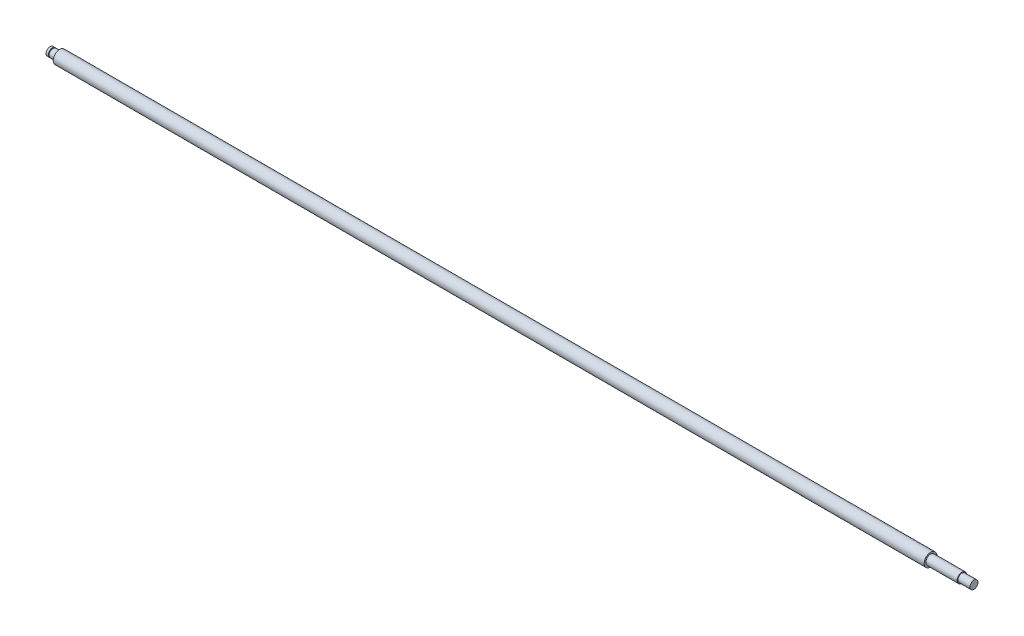
ISO-10303-21;
HEADER;
FILE_DESCRIPTION(('STEP AP214'),'2;1');
FILE_NAME('part.step','',(''),(''),'','','');
FILE_SCHEMA(('AUTOMOTIVE_DESIGN { 1 0 10303 214 1 1 1 1 }'));
ENDSEC;
DATA;
#1=APPLICATION_CONTEXT('core data for automotive mechanical design processes');
#2=APPLICATION_PROTOCOL_DEFINITION('international standard','automotive_design',2000,#1);
#3=PRODUCT_CONTEXT('',#1,'mechanical');
#4=PRODUCT('Part','Part','',(#3));
#5=PRODUCT_RELATED_PRODUCT_CATEGORY('part','',(#4));
#6=PRODUCT_DEFINITION_FORMATION('','',#4);
#7=PRODUCT_DEFINITION_CONTEXT('part definition',#1,'design');
#8=PRODUCT_DEFINITION('design','',#6,#7);
#9=PRODUCT_DEFINITION_SHAPE('','',#8);
#10=(LENGTH_UNIT() NAMED_UNIT(*) SI_UNIT(.MILLI.,.METRE.));
#11=(NAMED_UNIT(*) PLANE_ANGLE_UNIT() SI_UNIT($,.RADIAN.));
#12=(NAMED_UNIT(*) SI_UNIT($,.STERADIAN.) SOLID_ANGLE_UNIT());
#13=UNCERTAINTY_MEASURE_WITH_UNIT(LENGTH_MEASURE(1.E-05),#10,'distance_accuracy_value','');
#14=(GEOMETRIC_REPRESENTATION_CONTEXT(3) GLOBAL_UNCERTAINTY_ASSIGNED_CONTEXT((#13)) GLOBAL_UNIT_ASSIGNED_CONTEXT((#10,
#11,#12)) REPRESENTATION_CONTEXT('',''));
#15=CARTESIAN_POINT('',(0.,0.,0.));
#16=DIRECTION('',(0.,0.,1.));
#17=DIRECTION('',(1.,0.,0.));
#18=AXIS2_PLACEMENT_3D('',#15,#16,#17);
#19=CARTESIAN_POINT('',(-88.2232860327094,0.,0.));
#20=DIRECTION('',(1.,0.,0.));
#21=DIRECTION('',(0.,0.,-1.));
#22=AXIS2_PLACEMENT_3D('',#19,#20,#21);
#23=PLANE('',#22);
#24=CARTESIAN_POINT('',(-88.2232860327094,0.,0.));
#25=DIRECTION('',(-1.,0.,0.));
#26=DIRECTION('',(0.,0.,1.));
#27=AXIS2_PLACEMENT_3D('',#24,#25,#26);
#28=CIRCLE('',#27,5.);
#29=CARTESIAN_POINT('',(-88.2232860327094,0.,5.));
#30=VERTEX_POINT('',#29);
#31=EDGE_CURVE('E10',#30,#30,#28,.T.);
#32=ORIENTED_EDGE('',*,*,#31,.T.);
#33=EDGE_LOOP('',(#32));
#34=FACE_BOUND('',#33,.T.);
#35=ADVANCED_FACE('F30',(#34),#23,.F.);
#36=CARTESIAN_POINT('',(-89.4005556379638,0.,0.));
#37=DIRECTION('',(-1.,0.,0.));
#38=DIRECTION('',(0.,0.,1.));
#39=AXIS2_PLACEMENT_3D('',#36,#37,#38);
#40=CYLINDRICAL_SURFACE('',#39,5.);
#41=ORIENTED_EDGE('',*,*,#31,.F.);
#42=EDGE_LOOP('',(#41));
#43=FACE_BOUND('',#42,.T.);
#44=CARTESIAN_POINT('',(-85.3698891216912,0.,0.));
#45=DIRECTION('',(-1.,0.,0.));
#46=DIRECTION('',(0.,0.,1.));
#47=AXIS2_PLACEMENT_3D('',#44,#45,#46);
#48=CIRCLE('',#47,5.);
#49=CARTESIAN_POINT('',(-85.3698891216912,0.,5.));
#50=VERTEX_POINT('',#49);
#51=EDGE_CURVE('E36',#50,#50,#48,.T.);
#52=ORIENTED_EDGE('',*,*,#51,.T.);
#53=EDGE_LOOP('',(#52));
#54=FACE_BOUND('',#53,.T.);
#55=ADVANCED_FACE('F86',(#43,#54),#40,.T.);
#56=CARTESIAN_POINT('',(-85.3698891216912,5.,0.));
#57=DIRECTION('',(-1.,0.,0.));
#58=DIRECTION('',(0.,0.,1.));
#59=AXIS2_PLACEMENT_3D('',#56,#57,#58);
#60=PLANE('',#59);
#61=ORIENTED_EDGE('',*,*,#51,.F.);
#62=EDGE_LOOP('',(#61));
#63=FACE_BOUND('',#62,.T.);
#64=CARTESIAN_POINT('',(-85.3698891216912,0.,0.));
#65=DIRECTION('',(-1.,0.,0.));
#66=DIRECTION('',(0.,0.,1.));
#67=AXIS2_PLACEMENT_3D('',#64,#65,#66);
#68=CIRCLE('',#67,4.);
#69=CARTESIAN_POINT('',(-85.3698891216912,0.,4.));
#70=VERTEX_POINT('',#69);
#71=EDGE_CURVE('E40',#70,#70,#68,.T.);
#72=ORIENTED_EDGE('',*,*,#71,.T.);
#73=EDGE_LOOP('',(#72));
#74=FACE_BOUND('',#73,.T.);
#75=ADVANCED_FACE('F90',(#63,#74),#60,.F.);
#76=CARTESIAN_POINT('',(-89.4005556379638,0.,0.));
#77=DIRECTION('',(-1.,0.,0.));
#78=DIRECTION('',(0.,0.,1.));
#79=AXIS2_PLACEMENT_3D('',#76,#77,#78);
#80=CYLINDRICAL_SURFACE('',#79,4.);
#81=ORIENTED_EDGE('',*,*,#71,.F.);
#82=EDGE_LOOP('',(#81));
#83=FACE_BOUND('',#82,.T.);
#84=CARTESIAN_POINT('',(-84.2198891216913,0.,0.));
#85=DIRECTION('',(-1.,0.,0.));
#86=DIRECTION('',(0.,0.,1.));
#87=AXIS2_PLACEMENT_3D('',#84,#85,#86);
#88=CIRCLE('',#87,4.);
#89=CARTESIAN_POINT('',(-84.2198891216913,0.,4.));
#90=VERTEX_POINT('',#89);
#91=EDGE_CURVE('E44',#90,#90,#88,.T.);
#92=ORIENTED_EDGE('',*,*,#91,.T.);
#93=EDGE_LOOP('',(#92));
#94=FACE_BOUND('',#93,.T.);
#95=ADVANCED_FACE('F95',(#83,#94),#80,.T.);
#96=CARTESIAN_POINT('',(-84.2198891216913,4.,0.));
#97=DIRECTION('',(1.,0.,0.));
#98=DIRECTION('',(0.,0.,-1.));
#99=AXIS2_PLACEMENT_3D('',#96,#97,#98);
#100=PLANE('',#99);
#101=ORIENTED_EDGE('',*,*,#91,.F.);
#102=EDGE_LOOP('',(#101));
#103=FACE_BOUND('',#102,.T.);
#104=CARTESIAN_POINT('',(-84.2198891216913,0.,0.));
#105=DIRECTION('',(-1.,0.,0.));
#106=DIRECTION('',(0.,0.,1.));
#107=AXIS2_PLACEMENT_3D('',#104,#105,#106);
#108=CIRCLE('',#107,5.);
#109=CARTESIAN_POINT('',(-84.2198891216913,0.,5.));
#110=VERTEX_POINT('',#109);
#111=EDGE_CURVE('E49',#110,#110,#108,.T.);
#112=ORIENTED_EDGE('',*,*,#111,.T.);
#113=EDGE_LOOP('',(#112));
#114=FACE_BOUND('',#113,.T.);
#115=ADVANCED_FACE('F101',(#103,#114),#100,.F.);
#116=CARTESIAN_POINT('',(-89.4005556379638,0.,0.));
#117=DIRECTION('',(-1.,0.,0.));
#118=DIRECTION('',(0.,0.,1.));
#119=AXIS2_PLACEMENT_3D('',#116,#117,#118);
#120=CYLINDRICAL_SURFACE('',#119,5.);
#121=ORIENTED_EDGE('',*,*,#111,.F.);
#122=EDGE_LOOP('',(#121));
#123=FACE_BOUND('',#122,.T.);
#124=CARTESIAN_POINT('',(-76.2198891216913,0.,0.));
#125=DIRECTION('',(-1.,0.,0.));
#126=DIRECTION('',(0.,0.,1.));
#127=AXIS2_PLACEMENT_3D('',#124,#125,#126);
#128=CIRCLE('',#127,5.);
#129=CARTESIAN_POINT('',(-76.2198891216913,0.,5.));
#130=VERTEX_POINT('',#129);
#131=EDGE_CURVE('E52',#130,#130,#128,.T.);
#132=ORIENTED_EDGE('',*,*,#131,.T.);
#133=EDGE_LOOP('',(#132));
#134=FACE_BOUND('',#133,.T.);
#135=ADVANCED_FACE('F105',(#123,#134),#120,.T.);
#136=CARTESIAN_POINT('',(-76.2198891216913,5.,0.));
#137=DIRECTION('',(1.,0.,0.));
#138=DIRECTION('',(0.,0.,-1.));
#139=AXIS2_PLACEMENT_3D('',#136,#137,#138);
#140=PLANE('',#139);
#141=ORIENTED_EDGE('',*,*,#131,.F.);
#142=EDGE_LOOP('',(#141));
#143=FACE_BOUND('',#142,.T.);
#144=CARTESIAN_POINT('',(-76.2198891216913,0.,0.));
#145=DIRECTION('',(-1.,0.,0.));
#146=DIRECTION('',(0.,0.,1.));
#147=AXIS2_PLACEMENT_3D('',#144,#145,#146);
#148=CIRCLE('',#147,8.);
#149=CARTESIAN_POINT('',(-76.2198891216913,0.,8.));
#150=VERTEX_POINT('',#149);
#151=EDGE_CURVE('E55',#150,#150,#148,.T.);
#152=ORIENTED_EDGE('',*,*,#151,.T.);
#153=EDGE_LOOP('',(#152));
#154=FACE_BOUND('',#153,.T.);
#155=ADVANCED_FACE('F109',(#143,#154),#140,.F.);
#156=CARTESIAN_POINT('',(-89.4005556379638,0.,0.));
#157=DIRECTION('',(-1.,0.,0.));
#158=DIRECTION('',(0.,0.,1.));
#159=AXIS2_PLACEMENT_3D('',#156,#157,#158);
#160=CYLINDRICAL_SURFACE('',#159,8.);
#161=ORIENTED_EDGE('',*,*,#151,.F.);
#162=EDGE_LOOP('',(#161));
#163=FACE_BOUND('',#162,.T.);
#164=CARTESIAN_POINT('',(1007.78011087831,0.,0.));
#165=DIRECTION('',(-1.,0.,0.));
#166=DIRECTION('',(0.,0.,1.));
#167=AXIS2_PLACEMENT_3D('',#164,#165,#166);
#168=CIRCLE('',#167,8.);
#169=CARTESIAN_POINT('',(1007.78011087831,0.,8.));
#170=VERTEX_POINT('',#169);
#171=EDGE_CURVE('E58',#170,#170,#168,.T.);
#172=ORIENTED_EDGE('',*,*,#171,.T.);
#173=EDGE_LOOP('',(#172));
#174=FACE_BOUND('',#173,.T.);
#175=ADVANCED_FACE('F113',(#163,#174),#160,.T.);
#176=CARTESIAN_POINT('',(1007.78011087831,8.,0.));
#177=DIRECTION('',(-1.,0.,0.));
#178=DIRECTION('',(0.,0.,1.));
#179=AXIS2_PLACEMENT_3D('',#176,#177,#178);
#180=PLANE('',#179);
#181=ORIENTED_EDGE('',*,*,#171,.F.);
#182=EDGE_LOOP('',(#181));
#183=FACE_BOUND('',#182,.T.);
#184=CARTESIAN_POINT('',(1007.78011087831,0.,0.));
#185=DIRECTION('',(-1.,0.,0.));
#186=DIRECTION('',(0.,0.,1.));
#187=AXIS2_PLACEMENT_3D('',#184,#185,#186);
#188=CIRCLE('',#187,6.);
#189=CARTESIAN_POINT('',(1007.78011087831,0.,6.));
#190=VERTEX_POINT('',#189);
#191=EDGE_CURVE('E61',#190,#190,#188,.T.);
#192=ORIENTED_EDGE('',*,*,#191,.T.);
#193=EDGE_LOOP('',(#192));
#194=FACE_BOUND('',#193,.T.);
#195=ADVANCED_FACE('F117',(#183,#194),#180,.F.);
#196=CARTESIAN_POINT('',(-89.4005556379638,0.,0.));
#197=DIRECTION('',(-1.,0.,0.));
#198=DIRECTION('',(0.,0.,1.));
#199=AXIS2_PLACEMENT_3D('',#196,#197,#198);
#200=CYLINDRICAL_SURFACE('',#199,6.);
#201=ORIENTED_EDGE('',*,*,#191,.F.);
#202=EDGE_LOOP('',(#201));
#203=FACE_BOUND('',#202,.T.);
#204=CARTESIAN_POINT('',(1046.78011087831,0.,0.));
#205=DIRECTION('',(-1.,0.,0.));
#206=DIRECTION('',(0.,0.,1.));
#207=AXIS2_PLACEMENT_3D('',#204,#205,#206);
#208=CIRCLE('',#207,6.);
#209=CARTESIAN_POINT('',(1046.78011087831,0.,6.));
#210=VERTEX_POINT('',#209);
#211=EDGE_CURVE('E64',#210,#210,#208,.T.);
#212=ORIENTED_EDGE('',*,*,#211,.T.);
#213=EDGE_LOOP('',(#212));
#214=FACE_BOUND('',#213,.T.);
#215=ADVANCED_FACE('F121',(#203,#214),#200,.T.);
#216=CARTESIAN_POINT('',(1046.78011087831,6.,0.));
#217=DIRECTION('',(-1.,0.,0.));
#218=DIRECTION('',(0.,0.,1.));
#219=AXIS2_PLACEMENT_3D('',#216,#217,#218);
#220=PLANE('',#219);
#221=ORIENTED_EDGE('',*,*,#211,.F.);
#222=EDGE_LOOP('',(#221));
#223=FACE_BOUND('',#222,.T.);
#224=CARTESIAN_POINT('',(1046.78011087831,0.,0.));
#225=DIRECTION('',(-1.,0.,0.));
#226=DIRECTION('',(0.,0.,1.));
#227=AXIS2_PLACEMENT_3D('',#224,#225,#226);
#228=CIRCLE('',#227,5.);
#229=CARTESIAN_POINT('',(1046.78011087831,0.,5.));
#230=VERTEX_POINT('',#229);
#231=EDGE_CURVE('E67',#230,#230,#228,.T.);
#232=ORIENTED_EDGE('',*,*,#231,.T.);
#233=EDGE_LOOP('',(#232));
#234=FACE_BOUND('',#233,.T.);
#235=ADVANCED_FACE('F82',(#223,#234),#220,.F.);
#236=CARTESIAN_POINT('',(-89.4005556379638,0.,0.));
#237=DIRECTION('',(-1.,0.,0.));
#238=DIRECTION('',(0.,0.,1.));
#239=AXIS2_PLACEMENT_3D('',#236,#237,#238);
#240=CYLINDRICAL_SURFACE('',#239,5.);
#241=ORIENTED_EDGE('',*,*,#231,.F.);
#242=EDGE_LOOP('',(#241));
#243=FACE_BOUND('',#242,.T.);
#244=CARTESIAN_POINT('',(1061.78011087831,0.,0.));
#245=DIRECTION('',(-1.,0.,0.));
#246=DIRECTION('',(0.,0.,1.));
#247=AXIS2_PLACEMENT_3D('',#244,#245,#246);
#248=CIRCLE('',#247,5.);
#249=CARTESIAN_POINT('',(1061.78011087831,0.,5.));
#250=VERTEX_POINT('',#249);
#251=EDGE_CURVE('E70',#250,#250,#248,.T.);
#252=ORIENTED_EDGE('',*,*,#251,.T.);
#253=EDGE_LOOP('',(#252));
#254=FACE_BOUND('',#253,.T.);
#255=ADVANCED_FACE('F74',(#243,#254),#240,.T.);
#256=CARTESIAN_POINT('',(1061.78011087831,5.,0.));
#257=DIRECTION('',(-1.,0.,0.));
#258=DIRECTION('',(0.,0.,1.));
#259=AXIS2_PLACEMENT_3D('',#256,#257,#258);
#260=PLANE('',#259);
#261=ORIENTED_EDGE('',*,*,#251,.F.);
#262=EDGE_LOOP('',(#261));
#263=FACE_BOUND('',#262,.T.);
#264=ADVANCED_FACE('F76',(#263),#260,.F.);
#265=CLOSED_SHELL('',(#35,#55,#75,#95,#115,#135,#155,#175,#195,#215,#235,#255,#264));
#266=MANIFOLD_SOLID_BREP('B2',#265);
#267=ADVANCED_BREP_SHAPE_REPRESENTATION('',(#18,#266),#14);
#268=SHAPE_DEFINITION_REPRESENTATION(#9,#267);
ENDSEC;
END-ISO-10303-21;
